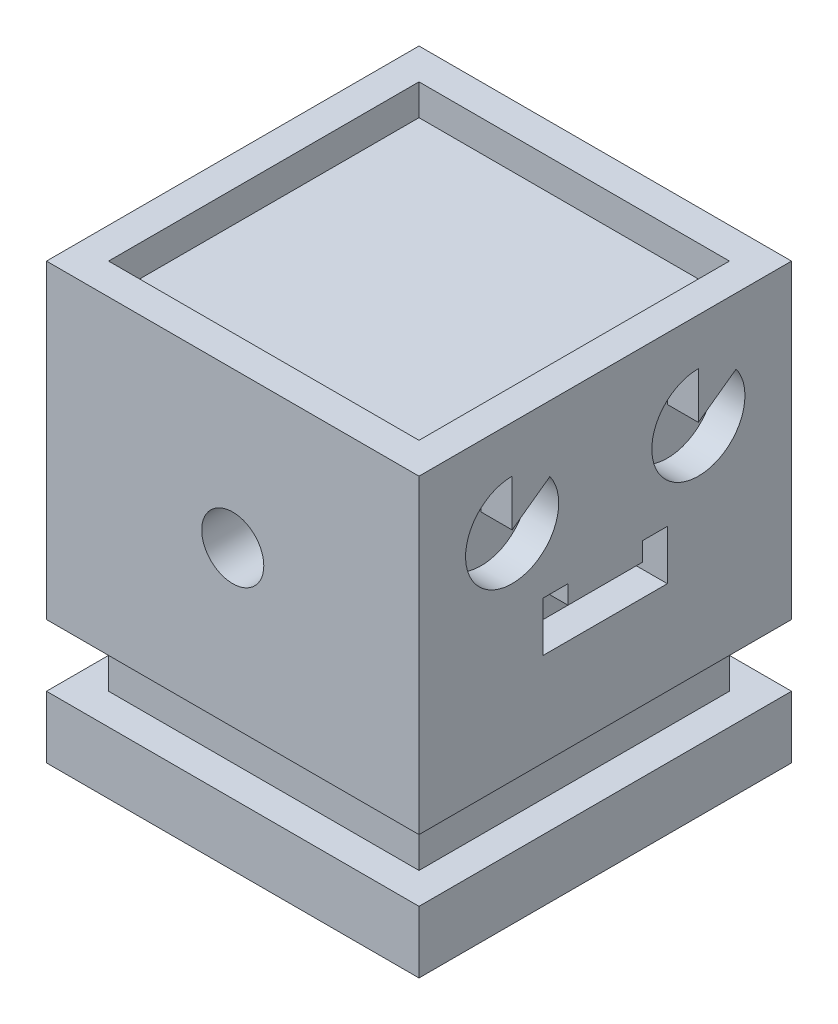
ISO-10303-21;
HEADER;
FILE_DESCRIPTION(('STEP AP214'),'2;1');
FILE_NAME('part.step','',(''),(''),'','','');
FILE_SCHEMA(('AUTOMOTIVE_DESIGN { 1 0 10303 214 1 1 1 1 }'));
ENDSEC;
DATA;
#1=APPLICATION_CONTEXT('core data for automotive mechanical design processes');
#2=APPLICATION_PROTOCOL_DEFINITION('international standard','automotive_design',2000,#1);
#3=PRODUCT_CONTEXT('',#1,'mechanical');
#4=PRODUCT('Part','Part','',(#3));
#5=PRODUCT_RELATED_PRODUCT_CATEGORY('part','',(#4));
#6=PRODUCT_DEFINITION_FORMATION('','',#4);
#7=PRODUCT_DEFINITION_CONTEXT('part definition',#1,'design');
#8=PRODUCT_DEFINITION('design','',#6,#7);
#9=PRODUCT_DEFINITION_SHAPE('','',#8);
#10=(LENGTH_UNIT() NAMED_UNIT(*) SI_UNIT(.MILLI.,.METRE.));
#11=(NAMED_UNIT(*) PLANE_ANGLE_UNIT() SI_UNIT($,.RADIAN.));
#12=(NAMED_UNIT(*) SI_UNIT($,.STERADIAN.) SOLID_ANGLE_UNIT());
#13=UNCERTAINTY_MEASURE_WITH_UNIT(LENGTH_MEASURE(1.E-05),#10,'distance_accuracy_value','');
#14=(GEOMETRIC_REPRESENTATION_CONTEXT(3) GLOBAL_UNCERTAINTY_ASSIGNED_CONTEXT((#13)) GLOBAL_UNIT_ASSIGNED_CONTEXT((#10,
#11,#12)) REPRESENTATION_CONTEXT('',''));
#15=CARTESIAN_POINT('',(0.,0.,0.));
#16=DIRECTION('',(0.,0.,1.));
#17=DIRECTION('',(1.,0.,0.));
#18=AXIS2_PLACEMENT_3D('',#15,#16,#17);
#19=CARTESIAN_POINT('',(0.,0.,60.));
#20=DIRECTION('',(0.,0.,-1.));
#21=DIRECTION('',(-1.,0.,0.));
#22=AXIS2_PLACEMENT_3D('',#19,#20,#21);
#23=PLANE('',#22);
#24=CARTESIAN_POINT('',(30.,45.,60.));
#25=DIRECTION('',(0.,0.,1.));
#26=DIRECTION('',(1.,0.,0.));
#27=AXIS2_PLACEMENT_3D('',#24,#25,#26);
#28=CIRCLE('',#27,5.);
#29=CARTESIAN_POINT('',(35.,45.,60.));
#30=VERTEX_POINT('',#29);
#31=EDGE_CURVE('E827',#30,#30,#28,.T.);
#32=ORIENTED_EDGE('',*,*,#31,.F.);
#33=EDGE_LOOP('',(#32));
#34=FACE_BOUND('',#33,.T.);
#35=DIRECTION('',(-1.,0.,0.));
#36=VECTOR('',#35,1.);
#37=CARTESIAN_POINT('',(0.,20.,60.));
#38=LINE('',#37,#36);
#39=CARTESIAN_POINT('',(60.,20.,60.));
#40=VERTEX_POINT('',#39);
#41=CARTESIAN_POINT('',(0.,20.,60.));
#42=VERTEX_POINT('',#41);
#43=EDGE_CURVE('E498',#40,#42,#38,.T.);
#44=ORIENTED_EDGE('',*,*,#43,.F.);
#45=DIRECTION('',(0.,1.,0.));
#46=VECTOR('',#45,1.);
#47=CARTESIAN_POINT('',(60.,0.,60.));
#48=LINE('',#47,#46);
#49=CARTESIAN_POINT('',(60.,70.,60.));
#50=VERTEX_POINT('',#49);
#51=EDGE_CURVE('E589',#40,#50,#48,.T.);
#52=ORIENTED_EDGE('',*,*,#51,.T.);
#53=DIRECTION('',(-1.,0.,0.));
#54=VECTOR('',#53,1.);
#55=CARTESIAN_POINT('',(0.,70.,60.));
#56=LINE('',#55,#54);
#57=CARTESIAN_POINT('',(0.,70.,60.));
#58=VERTEX_POINT('',#57);
#59=EDGE_CURVE('E594',#50,#58,#56,.T.);
#60=ORIENTED_EDGE('',*,*,#59,.T.);
#61=DIRECTION('',(0.,-1.,0.));
#62=VECTOR('',#61,1.);
#63=CARTESIAN_POINT('',(0.,0.,60.));
#64=LINE('',#63,#62);
#65=EDGE_CURVE('E581',#58,#42,#64,.T.);
#66=ORIENTED_EDGE('',*,*,#65,.T.);
#67=EDGE_LOOP('',(#44,#52,#60,#66));
#68=FACE_BOUND('',#67,.T.);
#69=ADVANCED_FACE('F39',(#34,#68),#23,.F.);
#70=CARTESIAN_POINT('',(0.,0.,0.));
#71=DIRECTION('',(0.,0.,-1.));
#72=DIRECTION('',(-1.,0.,0.));
#73=AXIS2_PLACEMENT_3D('',#70,#71,#72);
#74=PLANE('',#73);
#75=DIRECTION('',(1.,0.,0.));
#76=VECTOR('',#75,1.);
#77=CARTESIAN_POINT('',(0.,10.,0.));
#78=LINE('',#77,#76);
#79=CARTESIAN_POINT('',(0.,10.,0.));
#80=VERTEX_POINT('',#79);
#81=CARTESIAN_POINT('',(60.,10.,0.));
#82=VERTEX_POINT('',#81);
#83=EDGE_CURVE('E494',#80,#82,#78,.T.);
#84=ORIENTED_EDGE('',*,*,#83,.T.);
#85=DIRECTION('',(0.,1.,0.));
#86=VECTOR('',#85,1.);
#87=CARTESIAN_POINT('',(60.,0.,0.));
#88=LINE('',#87,#86);
#89=CARTESIAN_POINT('',(60.,0.,0.));
#90=VERTEX_POINT('',#89);
#91=EDGE_CURVE('E606',#90,#82,#88,.T.);
#92=ORIENTED_EDGE('',*,*,#91,.F.);
#93=DIRECTION('',(1.,0.,0.));
#94=VECTOR('',#93,1.);
#95=CARTESIAN_POINT('',(0.,0.,0.));
#96=LINE('',#95,#94);
#97=CARTESIAN_POINT('',(0.,0.,0.));
#98=VERTEX_POINT('',#97);
#99=EDGE_CURVE('E602',#98,#90,#96,.T.);
#100=ORIENTED_EDGE('',*,*,#99,.F.);
#101=DIRECTION('',(0.,-1.,0.));
#102=VECTOR('',#101,1.);
#103=CARTESIAN_POINT('',(0.,0.,0.));
#104=LINE('',#103,#102);
#105=EDGE_CURVE('E571',#80,#98,#104,.T.);
#106=ORIENTED_EDGE('',*,*,#105,.F.);
#107=EDGE_LOOP('',(#84,#92,#100,#106));
#108=FACE_BOUND('',#107,.T.);
#109=ADVANCED_FACE('F631',(#108),#74,.T.);
#110=CARTESIAN_POINT('',(0.,0.,60.));
#111=DIRECTION('',(1.,0.,0.));
#112=DIRECTION('',(0.,0.,-1.));
#113=AXIS2_PLACEMENT_3D('',#110,#111,#112);
#114=PLANE('',#113);
#115=CARTESIAN_POINT('',(0.,70.,0.));
#116=VERTEX_POINT('',#115);
#117=CARTESIAN_POINT('',(0.,20.,0.));
#118=VERTEX_POINT('',#117);
#119=EDGE_CURVE('E598',#116,#118,#104,.T.);
#120=ORIENTED_EDGE('',*,*,#119,.T.);
#121=DIRECTION('',(0.,0.,1.));
#122=VECTOR('',#121,1.);
#123=CARTESIAN_POINT('',(0.,20.,0.));
#124=LINE('',#123,#122);
#125=EDGE_CURVE('E511',#118,#42,#124,.T.);
#126=ORIENTED_EDGE('',*,*,#125,.T.);
#127=ORIENTED_EDGE('',*,*,#65,.F.);
#128=DIRECTION('',(0.,0.,-1.));
#129=VECTOR('',#128,1.);
#130=CARTESIAN_POINT('',(0.,70.,60.));
#131=LINE('',#130,#129);
#132=EDGE_CURVE('E597',#58,#116,#131,.T.);
#133=ORIENTED_EDGE('',*,*,#132,.T.);
#134=EDGE_LOOP('',(#120,#126,#127,#133));
#135=FACE_BOUND('',#134,.T.);
#136=ADVANCED_FACE('F665',(#135),#114,.F.);
#137=CARTESIAN_POINT('',(60.,0.,60.));
#138=DIRECTION('',(-1.,0.,0.));
#139=DIRECTION('',(0.,0.,1.));
#140=AXIS2_PLACEMENT_3D('',#137,#138,#139);
#141=PLANE('',#140);
#142=CARTESIAN_POINT('',(60.,55.,45.));
#143=DIRECTION('',(1.,0.,0.));
#144=DIRECTION('',(0.,0.,-1.));
#145=AXIS2_PLACEMENT_3D('',#142,#143,#144);
#146=CIRCLE('',#145,7.5);
#147=CARTESIAN_POINT('',(60.,62.5,45.));
#148=VERTEX_POINT('',#147);
#149=CARTESIAN_POINT('',(60.,59.4018531615386,38.9276290673038));
#150=VERTEX_POINT('',#149);
#151=EDGE_CURVE('E331',#148,#150,#146,.T.);
#152=ORIENTED_EDGE('',*,*,#151,.F.);
#153=DIRECTION('',(0.,1.,0.));
#154=VECTOR('',#153,1.);
#155=CARTESIAN_POINT('',(60.,0.,45.));
#156=LINE('',#155,#154);
#157=CARTESIAN_POINT('',(60.,55.,45.));
#158=VERTEX_POINT('',#157);
#159=EDGE_CURVE('E64',#158,#148,#156,.T.);
#160=ORIENTED_EDGE('',*,*,#159,.F.);
#161=DIRECTION('',(0.,0.586913754871805,-0.809649457692821));
#162=VECTOR('',#161,1.);
#163=CARTESIAN_POINT('',(60.,57.438021589324,41.6367411885402));
#164=LINE('',#163,#162);
#165=EDGE_CURVE('E321',#158,#150,#164,.T.);
#166=ORIENTED_EDGE('',*,*,#165,.T.);
#167=EDGE_LOOP('',(#152,#160,#166));
#168=FACE_BOUND('',#167,.T.);
#169=CARTESIAN_POINT('',(60.,55.,15.));
#170=DIRECTION('',(1.,0.,0.));
#171=DIRECTION('',(0.,0.,-1.));
#172=AXIS2_PLACEMENT_3D('',#169,#170,#171);
#173=CIRCLE('',#172,7.5);
#174=CARTESIAN_POINT('',(60.,62.5,15.));
#175=VERTEX_POINT('',#174);
#176=CARTESIAN_POINT('',(60.,59.4018531615385,8.92762906730384));
#177=VERTEX_POINT('',#176);
#178=EDGE_CURVE('E362',#175,#177,#173,.T.);
#179=ORIENTED_EDGE('',*,*,#178,.F.);
#180=DIRECTION('',(0.,1.,0.));
#181=VECTOR('',#180,1.);
#182=CARTESIAN_POINT('',(60.,55.,15.));
#183=LINE('',#182,#181);
#184=CARTESIAN_POINT('',(60.,55.,15.));
#185=VERTEX_POINT('',#184);
#186=EDGE_CURVE('E332',#185,#175,#183,.T.);
#187=ORIENTED_EDGE('',*,*,#186,.F.);
#188=DIRECTION('',(0.,0.586913754871805,-0.809649457692821));
#189=VECTOR('',#188,1.);
#190=CARTESIAN_POINT('',(60.,55.,15.));
#191=LINE('',#190,#189);
#192=EDGE_CURVE('E358',#185,#177,#191,.T.);
#193=ORIENTED_EDGE('',*,*,#192,.T.);
#194=EDGE_LOOP('',(#179,#187,#193));
#195=FACE_BOUND('',#194,.T.);
#196=DIRECTION('',(0.,-1.,0.));
#197=VECTOR('',#196,1.);
#198=CARTESIAN_POINT('',(60.,40.,40.));
#199=LINE('',#198,#197);
#200=CARTESIAN_POINT('',(60.,43.,40.));
#201=VERTEX_POINT('',#200);
#202=CARTESIAN_POINT('',(60.,35.,40.));
#203=VERTEX_POINT('',#202);
#204=EDGE_CURVE('E342',#201,#203,#199,.T.);
#205=ORIENTED_EDGE('',*,*,#204,.F.);
#206=DIRECTION('',(0.,0.,1.));
#207=VECTOR('',#206,1.);
#208=CARTESIAN_POINT('',(60.,43.,40.));
#209=LINE('',#208,#207);
#210=CARTESIAN_POINT('',(60.,43.,36.));
#211=VERTEX_POINT('',#210);
#212=EDGE_CURVE('E382',#211,#201,#209,.T.);
#213=ORIENTED_EDGE('',*,*,#212,.F.);
#214=DIRECTION('',(0.,1.,0.));
#215=VECTOR('',#214,1.);
#216=CARTESIAN_POINT('',(60.,40.,36.));
#217=LINE('',#216,#215);
#218=CARTESIAN_POINT('',(60.,40.,36.));
#219=VERTEX_POINT('',#218);
#220=EDGE_CURVE('E433',#219,#211,#217,.T.);
#221=ORIENTED_EDGE('',*,*,#220,.F.);
#222=DIRECTION('',(0.,0.,1.));
#223=VECTOR('',#222,1.);
#224=CARTESIAN_POINT('',(60.,40.,36.));
#225=LINE('',#224,#223);
#226=CARTESIAN_POINT('',(60.,40.,24.));
#227=VERTEX_POINT('',#226);
#228=EDGE_CURVE('E429',#227,#219,#225,.T.);
#229=ORIENTED_EDGE('',*,*,#228,.F.);
#230=DIRECTION('',(0.,-1.,0.));
#231=VECTOR('',#230,1.);
#232=CARTESIAN_POINT('',(60.,40.,24.));
#233=LINE('',#232,#231);
#234=CARTESIAN_POINT('',(60.,43.,24.));
#235=VERTEX_POINT('',#234);
#236=EDGE_CURVE('E425',#235,#227,#233,.T.);
#237=ORIENTED_EDGE('',*,*,#236,.F.);
#238=DIRECTION('',(0.,0.,1.));
#239=VECTOR('',#238,1.);
#240=CARTESIAN_POINT('',(60.,43.,24.));
#241=LINE('',#240,#239);
#242=CARTESIAN_POINT('',(60.,43.,20.));
#243=VERTEX_POINT('',#242);
#244=EDGE_CURVE('E421',#243,#235,#241,.T.);
#245=ORIENTED_EDGE('',*,*,#244,.F.);
#246=DIRECTION('',(0.,1.,0.));
#247=VECTOR('',#246,1.);
#248=CARTESIAN_POINT('',(60.,40.,20.));
#249=LINE('',#248,#247);
#250=CARTESIAN_POINT('',(60.,35.,20.));
#251=VERTEX_POINT('',#250);
#252=EDGE_CURVE('E417',#251,#243,#249,.T.);
#253=ORIENTED_EDGE('',*,*,#252,.F.);
#254=DIRECTION('',(0.,0.,-1.));
#255=VECTOR('',#254,1.);
#256=CARTESIAN_POINT('',(60.,35.,40.));
#257=LINE('',#256,#255);
#258=EDGE_CURVE('E413',#203,#251,#257,.T.);
#259=ORIENTED_EDGE('',*,*,#258,.F.);
#260=EDGE_LOOP('',(#205,#213,#221,#229,#237,#245,#253,#259));
#261=FACE_BOUND('',#260,.T.);
#262=ORIENTED_EDGE('',*,*,#51,.F.);
#263=DIRECTION('',(0.,0.,1.));
#264=VECTOR('',#263,1.);
#265=CARTESIAN_POINT('',(60.,20.,0.));
#266=LINE('',#265,#264);
#267=CARTESIAN_POINT('',(60.,20.,0.));
#268=VERTEX_POINT('',#267);
#269=EDGE_CURVE('E507',#268,#40,#266,.T.);
#270=ORIENTED_EDGE('',*,*,#269,.F.);
#271=CARTESIAN_POINT('',(60.,70.,0.));
#272=VERTEX_POINT('',#271);
#273=EDGE_CURVE('E605',#268,#272,#88,.T.);
#274=ORIENTED_EDGE('',*,*,#273,.T.);
#275=DIRECTION('',(0.,0.,-1.));
#276=VECTOR('',#275,1.);
#277=CARTESIAN_POINT('',(60.,70.,60.));
#278=LINE('',#277,#276);
#279=EDGE_CURVE('E616',#50,#272,#278,.T.);
#280=ORIENTED_EDGE('',*,*,#279,.F.);
#281=EDGE_LOOP('',(#262,#270,#274,#280));
#282=FACE_BOUND('',#281,.T.);
#283=ADVANCED_FACE('F657',(#168,#195,#261,#282),#141,.F.);
#284=CARTESIAN_POINT('',(0.,10.,60.));
#285=VERTEX_POINT('',#284);
#286=CARTESIAN_POINT('',(0.,0.,60.));
#287=VERTEX_POINT('',#286);
#288=EDGE_CURVE('E586',#285,#287,#64,.T.);
#289=ORIENTED_EDGE('',*,*,#288,.F.);
#290=DIRECTION('',(0.,0.,1.));
#291=VECTOR('',#290,1.);
#292=CARTESIAN_POINT('',(0.,10.,0.));
#293=LINE('',#292,#291);
#294=EDGE_CURVE('E502',#80,#285,#293,.T.);
#295=ORIENTED_EDGE('',*,*,#294,.F.);
#296=ORIENTED_EDGE('',*,*,#105,.T.);
#297=DIRECTION('',(0.,0.,-1.));
#298=VECTOR('',#297,1.);
#299=CARTESIAN_POINT('',(0.,0.,60.));
#300=LINE('',#299,#298);
#301=EDGE_CURVE('E11',#287,#98,#300,.T.);
#302=ORIENTED_EDGE('',*,*,#301,.F.);
#303=EDGE_LOOP('',(#289,#295,#296,#302));
#304=FACE_BOUND('',#303,.T.);
#305=ADVANCED_FACE('F41',(#304),#114,.F.);
#306=CARTESIAN_POINT('',(0.,0.,60.));
#307=DIRECTION('',(0.,1.,0.));
#308=DIRECTION('',(0.,0.,1.));
#309=AXIS2_PLACEMENT_3D('',#306,#307,#308);
#310=PLANE('',#309);
#311=DIRECTION('',(-1.,0.,0.));
#312=VECTOR('',#311,1.);
#313=CARTESIAN_POINT('',(50.,0.,50.));
#314=LINE('',#313,#312);
#315=CARTESIAN_POINT('',(50.,0.,50.));
#316=VERTEX_POINT('',#315);
#317=CARTESIAN_POINT('',(10.,0.,50.));
#318=VERTEX_POINT('',#317);
#319=EDGE_CURVE('E301',#316,#318,#314,.T.);
#320=ORIENTED_EDGE('',*,*,#319,.F.);
#321=DIRECTION('',(0.,0.,1.));
#322=VECTOR('',#321,1.);
#323=CARTESIAN_POINT('',(50.,0.,50.));
#324=LINE('',#323,#322);
#325=CARTESIAN_POINT('',(50.,0.,10.));
#326=VERTEX_POINT('',#325);
#327=EDGE_CURVE('E56',#326,#316,#324,.T.);
#328=ORIENTED_EDGE('',*,*,#327,.F.);
#329=DIRECTION('',(1.,0.,0.));
#330=VECTOR('',#329,1.);
#331=CARTESIAN_POINT('',(50.,0.,10.));
#332=LINE('',#331,#330);
#333=CARTESIAN_POINT('',(10.,0.,10.));
#334=VERTEX_POINT('',#333);
#335=EDGE_CURVE('E285',#334,#326,#332,.T.);
#336=ORIENTED_EDGE('',*,*,#335,.F.);
#337=DIRECTION('',(0.,0.,-1.));
#338=VECTOR('',#337,1.);
#339=CARTESIAN_POINT('',(10.,0.,50.));
#340=LINE('',#339,#338);
#341=EDGE_CURVE('E289',#318,#334,#340,.T.);
#342=ORIENTED_EDGE('',*,*,#341,.F.);
#343=EDGE_LOOP('',(#320,#328,#336,#342));
#344=FACE_BOUND('',#343,.T.);
#345=ORIENTED_EDGE('',*,*,#99,.T.);
#346=DIRECTION('',(0.,0.,-1.));
#347=VECTOR('',#346,1.);
#348=CARTESIAN_POINT('',(60.,0.,60.));
#349=LINE('',#348,#347);
#350=CARTESIAN_POINT('',(60.,0.,60.));
#351=VERTEX_POINT('',#350);
#352=EDGE_CURVE('E49',#351,#90,#349,.T.);
#353=ORIENTED_EDGE('',*,*,#352,.F.);
#354=DIRECTION('',(1.,0.,0.));
#355=VECTOR('',#354,1.);
#356=CARTESIAN_POINT('',(0.,0.,60.));
#357=LINE('',#356,#355);
#358=EDGE_CURVE('E585',#287,#351,#357,.T.);
#359=ORIENTED_EDGE('',*,*,#358,.F.);
#360=ORIENTED_EDGE('',*,*,#301,.T.);
#361=EDGE_LOOP('',(#345,#353,#359,#360));
#362=FACE_BOUND('',#361,.T.);
#363=ADVANCED_FACE('F643',(#344,#362),#310,.F.);
#364=ORIENTED_EDGE('',*,*,#91,.T.);
#365=DIRECTION('',(0.,0.,1.));
#366=VECTOR('',#365,1.);
#367=CARTESIAN_POINT('',(60.,10.,0.));
#368=LINE('',#367,#366);
#369=CARTESIAN_POINT('',(60.,10.,60.));
#370=VERTEX_POINT('',#369);
#371=EDGE_CURVE('E527',#82,#370,#368,.T.);
#372=ORIENTED_EDGE('',*,*,#371,.T.);
#373=EDGE_CURVE('E590',#351,#370,#48,.T.);
#374=ORIENTED_EDGE('',*,*,#373,.F.);
#375=ORIENTED_EDGE('',*,*,#352,.T.);
#376=EDGE_LOOP('',(#364,#372,#374,#375));
#377=FACE_BOUND('',#376,.T.);
#378=ADVANCED_FACE('F626',(#377),#141,.F.);
#379=CARTESIAN_POINT('',(0.,70.,60.));
#380=DIRECTION('',(0.,-1.,0.));
#381=DIRECTION('',(0.,0.,-1.));
#382=AXIS2_PLACEMENT_3D('',#379,#380,#381);
#383=PLANE('',#382);
#384=DIRECTION('',(1.,0.,0.));
#385=VECTOR('',#384,1.);
#386=CARTESIAN_POINT('',(5.,70.,55.));
#387=LINE('',#386,#385);
#388=CARTESIAN_POINT('',(5.,70.,55.));
#389=VERTEX_POINT('',#388);
#390=CARTESIAN_POINT('',(55.,70.,55.));
#391=VERTEX_POINT('',#390);
#392=EDGE_CURVE('E557',#389,#391,#387,.T.);
#393=ORIENTED_EDGE('',*,*,#392,.F.);
#394=DIRECTION('',(0.,0.,1.));
#395=VECTOR('',#394,1.);
#396=CARTESIAN_POINT('',(5.,70.,55.));
#397=LINE('',#396,#395);
#398=CARTESIAN_POINT('',(5.,70.,5.));
#399=VERTEX_POINT('',#398);
#400=EDGE_CURVE('E514',#399,#389,#397,.T.);
#401=ORIENTED_EDGE('',*,*,#400,.F.);
#402=DIRECTION('',(-1.,0.,0.));
#403=VECTOR('',#402,1.);
#404=CARTESIAN_POINT('',(5.,70.,5.));
#405=LINE('',#404,#403);
#406=CARTESIAN_POINT('',(55.,70.,5.));
#407=VERTEX_POINT('',#406);
#408=EDGE_CURVE('E542',#407,#399,#405,.T.);
#409=ORIENTED_EDGE('',*,*,#408,.F.);
#410=DIRECTION('',(0.,0.,-1.));
#411=VECTOR('',#410,1.);
#412=CARTESIAN_POINT('',(55.,70.,55.));
#413=LINE('',#412,#411);
#414=EDGE_CURVE('E561',#391,#407,#413,.T.);
#415=ORIENTED_EDGE('',*,*,#414,.F.);
#416=EDGE_LOOP('',(#393,#401,#409,#415));
#417=FACE_BOUND('',#416,.T.);
#418=DIRECTION('',(-1.,0.,0.));
#419=VECTOR('',#418,1.);
#420=CARTESIAN_POINT('',(0.,70.,0.));
#421=LINE('',#420,#419);
#422=EDGE_CURVE('E610',#272,#116,#421,.T.);
#423=ORIENTED_EDGE('',*,*,#422,.T.);
#424=ORIENTED_EDGE('',*,*,#132,.F.);
#425=ORIENTED_EDGE('',*,*,#59,.F.);
#426=ORIENTED_EDGE('',*,*,#279,.T.);
#427=EDGE_LOOP('',(#423,#424,#425,#426));
#428=FACE_BOUND('',#427,.T.);
#429=ADVANCED_FACE('F661',(#417,#428),#383,.F.);
#430=ORIENTED_EDGE('',*,*,#373,.T.);
#431=DIRECTION('',(1.,0.,0.));
#432=VECTOR('',#431,1.);
#433=CARTESIAN_POINT('',(0.,10.,60.));
#434=LINE('',#433,#432);
#435=EDGE_CURVE('E503',#285,#370,#434,.T.);
#436=ORIENTED_EDGE('',*,*,#435,.F.);
#437=ORIENTED_EDGE('',*,*,#288,.T.);
#438=ORIENTED_EDGE('',*,*,#358,.T.);
#439=EDGE_LOOP('',(#430,#436,#437,#438));
#440=FACE_BOUND('',#439,.T.);
#441=ADVANCED_FACE('F641',(#440),#23,.F.);
#442=CARTESIAN_POINT('',(30.,45.,0.));
#443=DIRECTION('',(0.,0.,1.));
#444=DIRECTION('',(1.,0.,0.));
#445=AXIS2_PLACEMENT_3D('',#442,#443,#444);
#446=CIRCLE('',#445,5.);
#447=CARTESIAN_POINT('',(35.,45.,0.));
#448=VERTEX_POINT('',#447);
#449=EDGE_CURVE('E819',#448,#448,#446,.T.);
#450=ORIENTED_EDGE('',*,*,#449,.T.);
#451=EDGE_LOOP('',(#450));
#452=FACE_BOUND('',#451,.T.);
#453=ORIENTED_EDGE('',*,*,#273,.F.);
#454=DIRECTION('',(-1.,0.,0.));
#455=VECTOR('',#454,1.);
#456=CARTESIAN_POINT('',(0.,20.,0.));
#457=LINE('',#456,#455);
#458=EDGE_CURVE('E497',#268,#118,#457,.T.);
#459=ORIENTED_EDGE('',*,*,#458,.T.);
#460=ORIENTED_EDGE('',*,*,#119,.F.);
#461=ORIENTED_EDGE('',*,*,#422,.F.);
#462=EDGE_LOOP('',(#453,#459,#460,#461));
#463=FACE_BOUND('',#462,.T.);
#464=ADVANCED_FACE('F669',(#452,#463),#74,.T.);
#465=CARTESIAN_POINT('',(5.,65.,55.));
#466=DIRECTION('',(-1.,0.,0.));
#467=DIRECTION('',(0.,0.,1.));
#468=AXIS2_PLACEMENT_3D('',#465,#466,#467);
#469=PLANE('',#468);
#470=ORIENTED_EDGE('',*,*,#400,.T.);
#471=DIRECTION('',(0.,1.,0.));
#472=VECTOR('',#471,1.);
#473=CARTESIAN_POINT('',(5.,65.,55.));
#474=LINE('',#473,#472);
#475=CARTESIAN_POINT('',(5.,65.,55.));
#476=VERTEX_POINT('',#475);
#477=EDGE_CURVE('E554',#476,#389,#474,.T.);
#478=ORIENTED_EDGE('',*,*,#477,.F.);
#479=DIRECTION('',(0.,0.,1.));
#480=VECTOR('',#479,1.);
#481=CARTESIAN_POINT('',(5.,65.,55.));
#482=LINE('',#481,#480);
#483=CARTESIAN_POINT('',(5.,65.,5.));
#484=VERTEX_POINT('',#483);
#485=EDGE_CURVE('E537',#484,#476,#482,.T.);
#486=ORIENTED_EDGE('',*,*,#485,.F.);
#487=DIRECTION('',(0.,1.,0.));
#488=VECTOR('',#487,1.);
#489=CARTESIAN_POINT('',(5.,65.,5.));
#490=LINE('',#489,#488);
#491=EDGE_CURVE('E568',#484,#399,#490,.T.);
#492=ORIENTED_EDGE('',*,*,#491,.T.);
#493=EDGE_LOOP('',(#470,#478,#486,#492));
#494=FACE_BOUND('',#493,.T.);
#495=ADVANCED_FACE('F671',(#494),#469,.F.);
#496=CARTESIAN_POINT('',(5.,65.,5.));
#497=DIRECTION('',(0.,0.,-1.));
#498=DIRECTION('',(-1.,0.,0.));
#499=AXIS2_PLACEMENT_3D('',#496,#497,#498);
#500=PLANE('',#499);
#501=ORIENTED_EDGE('',*,*,#408,.T.);
#502=ORIENTED_EDGE('',*,*,#491,.F.);
#503=DIRECTION('',(-1.,0.,0.));
#504=VECTOR('',#503,1.);
#505=CARTESIAN_POINT('',(5.,65.,5.));
#506=LINE('',#505,#504);
#507=CARTESIAN_POINT('',(55.,65.,5.));
#508=VERTEX_POINT('',#507);
#509=EDGE_CURVE('E550',#508,#484,#506,.T.);
#510=ORIENTED_EDGE('',*,*,#509,.F.);
#511=DIRECTION('',(0.,1.,0.));
#512=VECTOR('',#511,1.);
#513=CARTESIAN_POINT('',(55.,65.,5.));
#514=LINE('',#513,#512);
#515=EDGE_CURVE('E572',#508,#407,#514,.T.);
#516=ORIENTED_EDGE('',*,*,#515,.T.);
#517=EDGE_LOOP('',(#501,#502,#510,#516));
#518=FACE_BOUND('',#517,.T.);
#519=ADVANCED_FACE('F678',(#518),#500,.F.);
#520=CARTESIAN_POINT('',(55.,65.,55.));
#521=DIRECTION('',(1.,0.,0.));
#522=DIRECTION('',(0.,0.,-1.));
#523=AXIS2_PLACEMENT_3D('',#520,#521,#522);
#524=PLANE('',#523);
#525=ORIENTED_EDGE('',*,*,#414,.T.);
#526=ORIENTED_EDGE('',*,*,#515,.F.);
#527=DIRECTION('',(0.,0.,-1.));
#528=VECTOR('',#527,1.);
#529=CARTESIAN_POINT('',(55.,65.,55.));
#530=LINE('',#529,#528);
#531=CARTESIAN_POINT('',(55.,65.,55.));
#532=VERTEX_POINT('',#531);
#533=EDGE_CURVE('E546',#532,#508,#530,.T.);
#534=ORIENTED_EDGE('',*,*,#533,.F.);
#535=DIRECTION('',(0.,1.,0.));
#536=VECTOR('',#535,1.);
#537=CARTESIAN_POINT('',(55.,65.,55.));
#538=LINE('',#537,#536);
#539=EDGE_CURVE('E575',#532,#391,#538,.T.);
#540=ORIENTED_EDGE('',*,*,#539,.T.);
#541=EDGE_LOOP('',(#525,#526,#534,#540));
#542=FACE_BOUND('',#541,.T.);
#543=ADVANCED_FACE('F695',(#542),#524,.F.);
#544=CARTESIAN_POINT('',(5.,65.,55.));
#545=DIRECTION('',(0.,0.,1.));
#546=DIRECTION('',(1.,0.,0.));
#547=AXIS2_PLACEMENT_3D('',#544,#545,#546);
#548=PLANE('',#547);
#549=ORIENTED_EDGE('',*,*,#392,.T.);
#550=ORIENTED_EDGE('',*,*,#539,.F.);
#551=DIRECTION('',(1.,0.,0.));
#552=VECTOR('',#551,1.);
#553=CARTESIAN_POINT('',(5.,65.,55.));
#554=LINE('',#553,#552);
#555=EDGE_CURVE('E541',#476,#532,#554,.T.);
#556=ORIENTED_EDGE('',*,*,#555,.F.);
#557=ORIENTED_EDGE('',*,*,#477,.T.);
#558=EDGE_LOOP('',(#549,#550,#556,#557));
#559=FACE_BOUND('',#558,.T.);
#560=ADVANCED_FACE('F691',(#559),#548,.F.);
#561=CARTESIAN_POINT('',(0.,65.,0.));
#562=DIRECTION('',(0.,-1.,0.));
#563=DIRECTION('',(0.,0.,-1.));
#564=AXIS2_PLACEMENT_3D('',#561,#562,#563);
#565=PLANE('',#564);
#566=ORIENTED_EDGE('',*,*,#485,.T.);
#567=ORIENTED_EDGE('',*,*,#555,.T.);
#568=ORIENTED_EDGE('',*,*,#533,.T.);
#569=ORIENTED_EDGE('',*,*,#509,.T.);
#570=EDGE_LOOP('',(#566,#567,#568,#569));
#571=FACE_BOUND('',#570,.T.);
#572=ADVANCED_FACE('F694',(#571),#565,.F.);
#573=CARTESIAN_POINT('',(55.,20.,0.));
#574=DIRECTION('',(-1.,0.,0.));
#575=DIRECTION('',(0.,-1.,0.));
#576=AXIS2_PLACEMENT_3D('',#573,#574,#575);
#577=PLANE('',#576);
#578=DIRECTION('',(0.,0.,1.));
#579=VECTOR('',#578,1.);
#580=CARTESIAN_POINT('',(55.,20.,0.));
#581=LINE('',#580,#579);
#582=CARTESIAN_POINT('',(55.,20.,5.));
#583=VERTEX_POINT('',#582);
#584=CARTESIAN_POINT('',(55.,20.,55.));
#585=VERTEX_POINT('',#584);
#586=EDGE_CURVE('E493',#583,#585,#581,.T.);
#587=ORIENTED_EDGE('',*,*,#586,.T.);
#588=DIRECTION('',(0.,-1.,0.));
#589=VECTOR('',#588,1.);
#590=CARTESIAN_POINT('',(55.,20.,55.));
#591=LINE('',#590,#589);
#592=CARTESIAN_POINT('',(55.,10.,55.));
#593=VERTEX_POINT('',#592);
#594=EDGE_CURVE('E489',#585,#593,#591,.T.);
#595=ORIENTED_EDGE('',*,*,#594,.T.);
#596=DIRECTION('',(0.,0.,1.));
#597=VECTOR('',#596,1.);
#598=CARTESIAN_POINT('',(55.,10.,0.));
#599=LINE('',#598,#597);
#600=CARTESIAN_POINT('',(55.,10.,5.));
#601=VERTEX_POINT('',#600);
#602=EDGE_CURVE('E530',#601,#593,#599,.T.);
#603=ORIENTED_EDGE('',*,*,#602,.F.);
#604=DIRECTION('',(0.,1.,0.));
#605=VECTOR('',#604,1.);
#606=CARTESIAN_POINT('',(55.,20.,5.));
#607=LINE('',#606,#605);
#608=EDGE_CURVE('E481',#601,#583,#607,.T.);
#609=ORIENTED_EDGE('',*,*,#608,.T.);
#610=EDGE_LOOP('',(#587,#595,#603,#609));
#611=FACE_BOUND('',#610,.T.);
#612=ADVANCED_FACE('F705',(#611),#577,.F.);
#613=CARTESIAN_POINT('',(0.,20.,0.));
#614=DIRECTION('',(0.,1.,0.));
#615=DIRECTION('',(0.,0.,1.));
#616=AXIS2_PLACEMENT_3D('',#613,#614,#615);
#617=PLANE('',#616);
#618=DIRECTION('',(1.,0.,0.));
#619=VECTOR('',#618,1.);
#620=CARTESIAN_POINT('',(0.,20.,55.));
#621=LINE('',#620,#619);
#622=CARTESIAN_POINT('',(5.,20.,55.));
#623=VERTEX_POINT('',#622);
#624=EDGE_CURVE('E464',#623,#585,#621,.T.);
#625=ORIENTED_EDGE('',*,*,#624,.T.);
#626=ORIENTED_EDGE('',*,*,#586,.F.);
#627=DIRECTION('',(1.,0.,0.));
#628=VECTOR('',#627,1.);
#629=CARTESIAN_POINT('',(0.,20.,5.));
#630=LINE('',#629,#628);
#631=CARTESIAN_POINT('',(5.,20.,5.));
#632=VERTEX_POINT('',#631);
#633=EDGE_CURVE('E443',#632,#583,#630,.T.);
#634=ORIENTED_EDGE('',*,*,#633,.F.);
#635=DIRECTION('',(0.,0.,1.));
#636=VECTOR('',#635,1.);
#637=CARTESIAN_POINT('',(5.,20.,0.));
#638=LINE('',#637,#636);
#639=EDGE_CURVE('E515',#632,#623,#638,.T.);
#640=ORIENTED_EDGE('',*,*,#639,.T.);
#641=EDGE_LOOP('',(#625,#626,#634,#640));
#642=FACE_BOUND('',#641,.T.);
#643=ORIENTED_EDGE('',*,*,#269,.T.);
#644=ORIENTED_EDGE('',*,*,#43,.T.);
#645=ORIENTED_EDGE('',*,*,#125,.F.);
#646=ORIENTED_EDGE('',*,*,#458,.F.);
#647=EDGE_LOOP('',(#643,#644,#645,#646));
#648=FACE_BOUND('',#647,.T.);
#649=ADVANCED_FACE('F667',(#642,#648),#617,.F.);
#650=CARTESIAN_POINT('',(5.,20.,0.));
#651=DIRECTION('',(1.,0.,0.));
#652=DIRECTION('',(0.,1.,0.));
#653=AXIS2_PLACEMENT_3D('',#650,#651,#652);
#654=PLANE('',#653);
#655=DIRECTION('',(0.,0.,1.));
#656=VECTOR('',#655,1.);
#657=CARTESIAN_POINT('',(5.,10.,0.));
#658=LINE('',#657,#656);
#659=CARTESIAN_POINT('',(5.,10.,5.));
#660=VERTEX_POINT('',#659);
#661=CARTESIAN_POINT('',(5.,10.,55.));
#662=VERTEX_POINT('',#661);
#663=EDGE_CURVE('E519',#660,#662,#658,.T.);
#664=ORIENTED_EDGE('',*,*,#663,.T.);
#665=DIRECTION('',(0.,1.,0.));
#666=VECTOR('',#665,1.);
#667=CARTESIAN_POINT('',(5.,20.,55.));
#668=LINE('',#667,#666);
#669=EDGE_CURVE('E485',#662,#623,#668,.T.);
#670=ORIENTED_EDGE('',*,*,#669,.T.);
#671=ORIENTED_EDGE('',*,*,#639,.F.);
#672=DIRECTION('',(0.,-1.,0.));
#673=VECTOR('',#672,1.);
#674=CARTESIAN_POINT('',(5.,20.,5.));
#675=LINE('',#674,#673);
#676=EDGE_CURVE('E468',#632,#660,#675,.T.);
#677=ORIENTED_EDGE('',*,*,#676,.T.);
#678=EDGE_LOOP('',(#664,#670,#671,#677));
#679=FACE_BOUND('',#678,.T.);
#680=ADVANCED_FACE('F713',(#679),#654,.F.);
#681=CARTESIAN_POINT('',(0.,10.,0.));
#682=DIRECTION('',(0.,-1.,0.));
#683=DIRECTION('',(1.,0.,0.));
#684=AXIS2_PLACEMENT_3D('',#681,#682,#683);
#685=PLANE('',#684);
#686=ORIENTED_EDGE('',*,*,#435,.T.);
#687=ORIENTED_EDGE('',*,*,#371,.F.);
#688=ORIENTED_EDGE('',*,*,#83,.F.);
#689=ORIENTED_EDGE('',*,*,#294,.T.);
#690=EDGE_LOOP('',(#686,#687,#688,#689));
#691=FACE_BOUND('',#690,.T.);
#692=ORIENTED_EDGE('',*,*,#602,.T.);
#693=DIRECTION('',(1.,0.,0.));
#694=VECTOR('',#693,1.);
#695=CARTESIAN_POINT('',(0.,10.,55.));
#696=LINE('',#695,#694);
#697=EDGE_CURVE('E469',#662,#593,#696,.T.);
#698=ORIENTED_EDGE('',*,*,#697,.F.);
#699=ORIENTED_EDGE('',*,*,#663,.F.);
#700=DIRECTION('',(1.,0.,0.));
#701=VECTOR('',#700,1.);
#702=CARTESIAN_POINT('',(0.,10.,5.));
#703=LINE('',#702,#701);
#704=EDGE_CURVE('E472',#660,#601,#703,.T.);
#705=ORIENTED_EDGE('',*,*,#704,.T.);
#706=EDGE_LOOP('',(#692,#698,#699,#705));
#707=FACE_BOUND('',#706,.T.);
#708=ADVANCED_FACE('F636',(#691,#707),#685,.F.);
#709=CARTESIAN_POINT('',(0.,20.,5.));
#710=DIRECTION('',(0.,0.,1.));
#711=DIRECTION('',(1.,0.,0.));
#712=AXIS2_PLACEMENT_3D('',#709,#710,#711);
#713=PLANE('',#712);
#714=ORIENTED_EDGE('',*,*,#704,.F.);
#715=ORIENTED_EDGE('',*,*,#676,.F.);
#716=ORIENTED_EDGE('',*,*,#633,.T.);
#717=ORIENTED_EDGE('',*,*,#608,.F.);
#718=EDGE_LOOP('',(#714,#715,#716,#717));
#719=FACE_BOUND('',#718,.T.);
#720=ADVANCED_FACE('F712',(#719),#713,.F.);
#721=CARTESIAN_POINT('',(0.,20.,55.));
#722=DIRECTION('',(0.,0.,-1.));
#723=DIRECTION('',(-1.,0.,0.));
#724=AXIS2_PLACEMENT_3D('',#721,#722,#723);
#725=PLANE('',#724);
#726=ORIENTED_EDGE('',*,*,#624,.F.);
#727=ORIENTED_EDGE('',*,*,#669,.F.);
#728=ORIENTED_EDGE('',*,*,#697,.T.);
#729=ORIENTED_EDGE('',*,*,#594,.F.);
#730=EDGE_LOOP('',(#726,#727,#728,#729));
#731=FACE_BOUND('',#730,.T.);
#732=ADVANCED_FACE('F722',(#731),#725,.F.);
#733=CARTESIAN_POINT('',(55.,43.,40.));
#734=DIRECTION('',(0.,1.,0.));
#735=DIRECTION('',(0.,0.,1.));
#736=AXIS2_PLACEMENT_3D('',#733,#734,#735);
#737=PLANE('',#736);
#738=ORIENTED_EDGE('',*,*,#212,.T.);
#739=DIRECTION('',(1.,0.,0.));
#740=VECTOR('',#739,1.);
#741=CARTESIAN_POINT('',(55.,43.,40.));
#742=LINE('',#741,#740);
#743=CARTESIAN_POINT('',(55.,43.,40.));
#744=VERTEX_POINT('',#743);
#745=EDGE_CURVE('E439',#744,#201,#742,.T.);
#746=ORIENTED_EDGE('',*,*,#745,.F.);
#747=DIRECTION('',(0.,0.,1.));
#748=VECTOR('',#747,1.);
#749=CARTESIAN_POINT('',(55.,43.,40.));
#750=LINE('',#749,#748);
#751=CARTESIAN_POINT('',(55.,43.,36.));
#752=VERTEX_POINT('',#751);
#753=EDGE_CURVE('E405',#752,#744,#750,.T.);
#754=ORIENTED_EDGE('',*,*,#753,.F.);
#755=DIRECTION('',(1.,0.,0.));
#756=VECTOR('',#755,1.);
#757=CARTESIAN_POINT('',(55.,43.,36.));
#758=LINE('',#757,#756);
#759=EDGE_CURVE('E444',#752,#211,#758,.T.);
#760=ORIENTED_EDGE('',*,*,#759,.T.);
#761=EDGE_LOOP('',(#738,#746,#754,#760));
#762=FACE_BOUND('',#761,.T.);
#763=ADVANCED_FACE('F726',(#762),#737,.F.);
#764=CARTESIAN_POINT('',(55.,40.,36.));
#765=DIRECTION('',(0.,0.,-1.));
#766=DIRECTION('',(-1.,0.,0.));
#767=AXIS2_PLACEMENT_3D('',#764,#765,#766);
#768=PLANE('',#767);
#769=ORIENTED_EDGE('',*,*,#220,.T.);
#770=ORIENTED_EDGE('',*,*,#759,.F.);
#771=DIRECTION('',(0.,1.,0.));
#772=VECTOR('',#771,1.);
#773=CARTESIAN_POINT('',(55.,40.,36.));
#774=LINE('',#773,#772);
#775=CARTESIAN_POINT('',(55.,40.,36.));
#776=VERTEX_POINT('',#775);
#777=EDGE_CURVE('E401',#776,#752,#774,.T.);
#778=ORIENTED_EDGE('',*,*,#777,.F.);
#779=DIRECTION('',(1.,0.,0.));
#780=VECTOR('',#779,1.);
#781=CARTESIAN_POINT('',(55.,40.,36.));
#782=LINE('',#781,#780);
#783=EDGE_CURVE('E447',#776,#219,#782,.T.);
#784=ORIENTED_EDGE('',*,*,#783,.T.);
#785=EDGE_LOOP('',(#769,#770,#778,#784));
#786=FACE_BOUND('',#785,.T.);
#787=ADVANCED_FACE('F752',(#786),#768,.F.);
#788=CARTESIAN_POINT('',(55.,40.,36.));
#789=DIRECTION('',(0.,1.,0.));
#790=DIRECTION('',(0.,0.,1.));
#791=AXIS2_PLACEMENT_3D('',#788,#789,#790);
#792=PLANE('',#791);
#793=ORIENTED_EDGE('',*,*,#228,.T.);
#794=ORIENTED_EDGE('',*,*,#783,.F.);
#795=DIRECTION('',(0.,0.,1.));
#796=VECTOR('',#795,1.);
#797=CARTESIAN_POINT('',(55.,40.,36.));
#798=LINE('',#797,#796);
#799=CARTESIAN_POINT('',(55.,40.,24.));
#800=VERTEX_POINT('',#799);
#801=EDGE_CURVE('E397',#800,#776,#798,.T.);
#802=ORIENTED_EDGE('',*,*,#801,.F.);
#803=DIRECTION('',(1.,0.,0.));
#804=VECTOR('',#803,1.);
#805=CARTESIAN_POINT('',(55.,40.,24.));
#806=LINE('',#805,#804);
#807=EDGE_CURVE('E450',#800,#227,#806,.T.);
#808=ORIENTED_EDGE('',*,*,#807,.T.);
#809=EDGE_LOOP('',(#793,#794,#802,#808));
#810=FACE_BOUND('',#809,.T.);
#811=ADVANCED_FACE('F748',(#810),#792,.F.);
#812=CARTESIAN_POINT('',(55.,40.,24.));
#813=DIRECTION('',(0.,0.,1.));
#814=DIRECTION('',(1.,0.,0.));
#815=AXIS2_PLACEMENT_3D('',#812,#813,#814);
#816=PLANE('',#815);
#817=ORIENTED_EDGE('',*,*,#236,.T.);
#818=ORIENTED_EDGE('',*,*,#807,.F.);
#819=DIRECTION('',(0.,-1.,0.));
#820=VECTOR('',#819,1.);
#821=CARTESIAN_POINT('',(55.,40.,24.));
#822=LINE('',#821,#820);
#823=CARTESIAN_POINT('',(55.,43.,24.));
#824=VERTEX_POINT('',#823);
#825=EDGE_CURVE('E393',#824,#800,#822,.T.);
#826=ORIENTED_EDGE('',*,*,#825,.F.);
#827=DIRECTION('',(1.,0.,0.));
#828=VECTOR('',#827,1.);
#829=CARTESIAN_POINT('',(55.,43.,24.));
#830=LINE('',#829,#828);
#831=EDGE_CURVE('E453',#824,#235,#830,.T.);
#832=ORIENTED_EDGE('',*,*,#831,.T.);
#833=EDGE_LOOP('',(#817,#818,#826,#832));
#834=FACE_BOUND('',#833,.T.);
#835=ADVANCED_FACE('F744',(#834),#816,.F.);
#836=CARTESIAN_POINT('',(55.,43.,24.));
#837=DIRECTION('',(0.,1.,0.));
#838=DIRECTION('',(0.,0.,1.));
#839=AXIS2_PLACEMENT_3D('',#836,#837,#838);
#840=PLANE('',#839);
#841=ORIENTED_EDGE('',*,*,#244,.T.);
#842=ORIENTED_EDGE('',*,*,#831,.F.);
#843=DIRECTION('',(0.,0.,1.));
#844=VECTOR('',#843,1.);
#845=CARTESIAN_POINT('',(55.,43.,24.));
#846=LINE('',#845,#844);
#847=CARTESIAN_POINT('',(55.,43.,20.));
#848=VERTEX_POINT('',#847);
#849=EDGE_CURVE('E389',#848,#824,#846,.T.);
#850=ORIENTED_EDGE('',*,*,#849,.F.);
#851=DIRECTION('',(1.,0.,0.));
#852=VECTOR('',#851,1.);
#853=CARTESIAN_POINT('',(55.,43.,20.));
#854=LINE('',#853,#852);
#855=EDGE_CURVE('E456',#848,#243,#854,.T.);
#856=ORIENTED_EDGE('',*,*,#855,.T.);
#857=EDGE_LOOP('',(#841,#842,#850,#856));
#858=FACE_BOUND('',#857,.T.);
#859=ADVANCED_FACE('F740',(#858),#840,.F.);
#860=CARTESIAN_POINT('',(55.,40.,20.));
#861=DIRECTION('',(0.,0.,-1.));
#862=DIRECTION('',(-1.,0.,0.));
#863=AXIS2_PLACEMENT_3D('',#860,#861,#862);
#864=PLANE('',#863);
#865=ORIENTED_EDGE('',*,*,#252,.T.);
#866=ORIENTED_EDGE('',*,*,#855,.F.);
#867=DIRECTION('',(0.,1.,0.));
#868=VECTOR('',#867,1.);
#869=CARTESIAN_POINT('',(55.,40.,20.));
#870=LINE('',#869,#868);
#871=CARTESIAN_POINT('',(55.,35.,20.));
#872=VERTEX_POINT('',#871);
#873=EDGE_CURVE('E386',#872,#848,#870,.T.);
#874=ORIENTED_EDGE('',*,*,#873,.F.);
#875=DIRECTION('',(1.,0.,0.));
#876=VECTOR('',#875,1.);
#877=CARTESIAN_POINT('',(55.,35.,20.));
#878=LINE('',#877,#876);
#879=EDGE_CURVE('E459',#872,#251,#878,.T.);
#880=ORIENTED_EDGE('',*,*,#879,.T.);
#881=EDGE_LOOP('',(#865,#866,#874,#880));
#882=FACE_BOUND('',#881,.T.);
#883=ADVANCED_FACE('F736',(#882),#864,.F.);
#884=CARTESIAN_POINT('',(55.,35.,40.));
#885=DIRECTION('',(0.,-1.,0.));
#886=DIRECTION('',(0.,0.,-1.));
#887=AXIS2_PLACEMENT_3D('',#884,#885,#886);
#888=PLANE('',#887);
#889=ORIENTED_EDGE('',*,*,#258,.T.);
#890=ORIENTED_EDGE('',*,*,#879,.F.);
#891=DIRECTION('',(0.,0.,-1.));
#892=VECTOR('',#891,1.);
#893=CARTESIAN_POINT('',(55.,35.,40.));
#894=LINE('',#893,#892);
#895=CARTESIAN_POINT('',(55.,35.,40.));
#896=VERTEX_POINT('',#895);
#897=EDGE_CURVE('E381',#896,#872,#894,.T.);
#898=ORIENTED_EDGE('',*,*,#897,.F.);
#899=DIRECTION('',(1.,0.,0.));
#900=VECTOR('',#899,1.);
#901=CARTESIAN_POINT('',(55.,35.,40.));
#902=LINE('',#901,#900);
#903=EDGE_CURVE('E409',#896,#203,#902,.T.);
#904=ORIENTED_EDGE('',*,*,#903,.T.);
#905=EDGE_LOOP('',(#889,#890,#898,#904));
#906=FACE_BOUND('',#905,.T.);
#907=ADVANCED_FACE('F732',(#906),#888,.F.);
#908=CARTESIAN_POINT('',(55.,40.,40.));
#909=DIRECTION('',(0.,0.,1.));
#910=DIRECTION('',(1.,0.,0.));
#911=AXIS2_PLACEMENT_3D('',#908,#909,#910);
#912=PLANE('',#911);
#913=ORIENTED_EDGE('',*,*,#204,.T.);
#914=ORIENTED_EDGE('',*,*,#903,.F.);
#915=DIRECTION('',(0.,-1.,0.));
#916=VECTOR('',#915,1.);
#917=CARTESIAN_POINT('',(55.,40.,40.));
#918=LINE('',#917,#916);
#919=EDGE_CURVE('E378',#744,#896,#918,.T.);
#920=ORIENTED_EDGE('',*,*,#919,.F.);
#921=ORIENTED_EDGE('',*,*,#745,.T.);
#922=EDGE_LOOP('',(#913,#914,#920,#921));
#923=FACE_BOUND('',#922,.T.);
#924=ADVANCED_FACE('F728',(#923),#912,.F.);
#925=CARTESIAN_POINT('',(55.,0.,0.));
#926=DIRECTION('',(-1.,0.,0.));
#927=DIRECTION('',(0.,0.,1.));
#928=AXIS2_PLACEMENT_3D('',#925,#926,#927);
#929=PLANE('',#928);
#930=ORIENTED_EDGE('',*,*,#919,.T.);
#931=ORIENTED_EDGE('',*,*,#897,.T.);
#932=ORIENTED_EDGE('',*,*,#873,.T.);
#933=ORIENTED_EDGE('',*,*,#849,.T.);
#934=ORIENTED_EDGE('',*,*,#825,.T.);
#935=ORIENTED_EDGE('',*,*,#801,.T.);
#936=ORIENTED_EDGE('',*,*,#777,.T.);
#937=ORIENTED_EDGE('',*,*,#753,.T.);
#938=EDGE_LOOP('',(#930,#931,#932,#933,#934,#935,#936,#937));
#939=FACE_BOUND('',#938,.T.);
#940=ADVANCED_FACE('F731',(#939),#929,.F.);
#941=CARTESIAN_POINT('',(55.,55.,15.));
#942=DIRECTION('',(0.,0.,-1.));
#943=DIRECTION('',(-1.,0.,0.));
#944=AXIS2_PLACEMENT_3D('',#941,#942,#943);
#945=PLANE('',#944);
#946=ORIENTED_EDGE('',*,*,#186,.T.);
#947=DIRECTION('',(1.,0.,0.));
#948=VECTOR('',#947,1.);
#949=CARTESIAN_POINT('',(55.,62.5,15.));
#950=LINE('',#949,#948);
#951=CARTESIAN_POINT('',(55.,62.5,15.));
#952=VERTEX_POINT('',#951);
#953=EDGE_CURVE('E348',#952,#175,#950,.T.);
#954=ORIENTED_EDGE('',*,*,#953,.F.);
#955=DIRECTION('',(0.,1.,0.));
#956=VECTOR('',#955,1.);
#957=CARTESIAN_POINT('',(55.,55.,15.));
#958=LINE('',#957,#956);
#959=CARTESIAN_POINT('',(55.,55.,15.));
#960=VERTEX_POINT('',#959);
#961=EDGE_CURVE('E363',#960,#952,#958,.T.);
#962=ORIENTED_EDGE('',*,*,#961,.F.);
#963=DIRECTION('',(1.,0.,0.));
#964=VECTOR('',#963,1.);
#965=CARTESIAN_POINT('',(55.,55.,15.));
#966=LINE('',#965,#964);
#967=EDGE_CURVE('E310',#960,#185,#966,.T.);
#968=ORIENTED_EDGE('',*,*,#967,.T.);
#969=EDGE_LOOP('',(#946,#954,#962,#968));
#970=FACE_BOUND('',#969,.T.);
#971=ADVANCED_FACE('F762',(#970),#945,.F.);
#972=CARTESIAN_POINT('',(55.,55.,15.));
#973=DIRECTION('',(0.,-0.809649457692821,-0.586913754871805));
#974=DIRECTION('',(0.,0.586913754871805,-0.809649457692821));
#975=AXIS2_PLACEMENT_3D('',#972,#973,#974);
#976=PLANE('',#975);
#977=ORIENTED_EDGE('',*,*,#192,.F.);
#978=ORIENTED_EDGE('',*,*,#967,.F.);
#979=DIRECTION('',(0.,0.586913754871805,-0.809649457692821));
#980=VECTOR('',#979,1.);
#981=CARTESIAN_POINT('',(55.,55.,15.));
#982=LINE('',#981,#980);
#983=CARTESIAN_POINT('',(55.,59.4018531615385,8.92762906730384));
#984=VERTEX_POINT('',#983);
#985=EDGE_CURVE('E352',#960,#984,#982,.T.);
#986=ORIENTED_EDGE('',*,*,#985,.T.);
#987=DIRECTION('',(1.,0.,0.));
#988=VECTOR('',#987,1.);
#989=CARTESIAN_POINT('',(55.,59.4018531615385,8.92762906730384));
#990=LINE('',#989,#988);
#991=EDGE_CURVE('E353',#984,#177,#990,.T.);
#992=ORIENTED_EDGE('',*,*,#991,.T.);
#993=EDGE_LOOP('',(#977,#978,#986,#992));
#994=FACE_BOUND('',#993,.T.);
#995=ADVANCED_FACE('F770',(#994),#976,.T.);
#996=CARTESIAN_POINT('',(55.,55.,15.));
#997=DIRECTION('',(1.,0.,0.));
#998=DIRECTION('',(0.,0.,-1.));
#999=AXIS2_PLACEMENT_3D('',#996,#997,#998);
#1000=CYLINDRICAL_SURFACE('',#999,7.5);
#1001=ORIENTED_EDGE('',*,*,#178,.T.);
#1002=ORIENTED_EDGE('',*,*,#991,.F.);
#1003=CARTESIAN_POINT('',(55.,55.,15.));
#1004=DIRECTION('',(1.,0.,0.));
#1005=DIRECTION('',(0.,0.,-1.));
#1006=AXIS2_PLACEMENT_3D('',#1003,#1004,#1005);
#1007=CIRCLE('',#1006,7.5);
#1008=EDGE_CURVE('E371',#952,#984,#1007,.T.);
#1009=ORIENTED_EDGE('',*,*,#1008,.F.);
#1010=ORIENTED_EDGE('',*,*,#953,.T.);
#1011=EDGE_LOOP('',(#1001,#1002,#1009,#1010));
#1012=FACE_BOUND('',#1011,.T.);
#1013=ADVANCED_FACE('F768',(#1012),#1000,.F.);
#1014=CARTESIAN_POINT('',(55.,55.,15.));
#1015=DIRECTION('',(1.,0.,0.));
#1016=DIRECTION('',(0.,0.,-1.));
#1017=AXIS2_PLACEMENT_3D('',#1014,#1015,#1016);
#1018=PLANE('',#1017);
#1019=ORIENTED_EDGE('',*,*,#961,.T.);
#1020=ORIENTED_EDGE('',*,*,#1008,.T.);
#1021=ORIENTED_EDGE('',*,*,#985,.F.);
#1022=EDGE_LOOP('',(#1019,#1020,#1021));
#1023=FACE_BOUND('',#1022,.T.);
#1024=ADVANCED_FACE('F764',(#1023),#1018,.T.);
#1025=CARTESIAN_POINT('',(55.,0.,45.));
#1026=DIRECTION('',(0.,0.,-1.));
#1027=DIRECTION('',(-1.,0.,0.));
#1028=AXIS2_PLACEMENT_3D('',#1025,#1026,#1027);
#1029=PLANE('',#1028);
#1030=ORIENTED_EDGE('',*,*,#159,.T.);
#1031=DIRECTION('',(1.,0.,0.));
#1032=VECTOR('',#1031,1.);
#1033=CARTESIAN_POINT('',(55.,62.5,45.));
#1034=LINE('',#1033,#1032);
#1035=CARTESIAN_POINT('',(55.,62.5,45.));
#1036=VERTEX_POINT('',#1035);
#1037=EDGE_CURVE('E328',#1036,#148,#1034,.T.);
#1038=ORIENTED_EDGE('',*,*,#1037,.F.);
#1039=DIRECTION('',(0.,1.,0.));
#1040=VECTOR('',#1039,1.);
#1041=CARTESIAN_POINT('',(55.,0.,45.));
#1042=LINE('',#1041,#1040);
#1043=CARTESIAN_POINT('',(55.,55.,45.));
#1044=VERTEX_POINT('',#1043);
#1045=EDGE_CURVE('E316',#1044,#1036,#1042,.T.);
#1046=ORIENTED_EDGE('',*,*,#1045,.F.);
#1047=DIRECTION('',(1.,0.,0.));
#1048=VECTOR('',#1047,1.);
#1049=CARTESIAN_POINT('',(55.,55.,45.));
#1050=LINE('',#1049,#1048);
#1051=EDGE_CURVE('E339',#1044,#158,#1050,.T.);
#1052=ORIENTED_EDGE('',*,*,#1051,.T.);
#1053=EDGE_LOOP('',(#1030,#1038,#1046,#1052));
#1054=FACE_BOUND('',#1053,.T.);
#1055=ADVANCED_FACE('F767',(#1054),#1029,.F.);
#1056=CARTESIAN_POINT('',(55.,57.438021589324,41.6367411885402));
#1057=DIRECTION('',(0.,-0.809649457692821,-0.586913754871805));
#1058=DIRECTION('',(0.,0.586913754871805,-0.809649457692821));
#1059=AXIS2_PLACEMENT_3D('',#1056,#1057,#1058);
#1060=PLANE('',#1059);
#1061=ORIENTED_EDGE('',*,*,#165,.F.);
#1062=ORIENTED_EDGE('',*,*,#1051,.F.);
#1063=DIRECTION('',(0.,0.586913754871805,-0.809649457692821));
#1064=VECTOR('',#1063,1.);
#1065=CARTESIAN_POINT('',(55.,57.438021589324,41.6367411885402));
#1066=LINE('',#1065,#1064);
#1067=CARTESIAN_POINT('',(55.,59.4018531615386,38.9276290673038));
#1068=VERTEX_POINT('',#1067);
#1069=EDGE_CURVE('E325',#1044,#1068,#1066,.T.);
#1070=ORIENTED_EDGE('',*,*,#1069,.T.);
#1071=DIRECTION('',(1.,0.,0.));
#1072=VECTOR('',#1071,1.);
#1073=CARTESIAN_POINT('',(55.,59.4018531615386,38.9276290673038));
#1074=LINE('',#1073,#1072);
#1075=EDGE_CURVE('E343',#1068,#150,#1074,.T.);
#1076=ORIENTED_EDGE('',*,*,#1075,.T.);
#1077=EDGE_LOOP('',(#1061,#1062,#1070,#1076));
#1078=FACE_BOUND('',#1077,.T.);
#1079=ADVANCED_FACE('F782',(#1078),#1060,.T.);
#1080=CARTESIAN_POINT('',(55.,55.,45.));
#1081=DIRECTION('',(1.,0.,0.));
#1082=DIRECTION('',(0.,0.,-1.));
#1083=AXIS2_PLACEMENT_3D('',#1080,#1081,#1082);
#1084=CYLINDRICAL_SURFACE('',#1083,7.5);
#1085=ORIENTED_EDGE('',*,*,#151,.T.);
#1086=ORIENTED_EDGE('',*,*,#1075,.F.);
#1087=CARTESIAN_POINT('',(55.,55.,45.));
#1088=DIRECTION('',(1.,0.,0.));
#1089=DIRECTION('',(0.,0.,-1.));
#1090=AXIS2_PLACEMENT_3D('',#1087,#1088,#1089);
#1091=CIRCLE('',#1090,7.5);
#1092=EDGE_CURVE('E320',#1036,#1068,#1091,.T.);
#1093=ORIENTED_EDGE('',*,*,#1092,.F.);
#1094=ORIENTED_EDGE('',*,*,#1037,.T.);
#1095=EDGE_LOOP('',(#1085,#1086,#1093,#1094));
#1096=FACE_BOUND('',#1095,.T.);
#1097=ADVANCED_FACE('F783',(#1096),#1084,.F.);
#1098=CARTESIAN_POINT('',(55.,0.,0.));
#1099=DIRECTION('',(1.,0.,0.));
#1100=DIRECTION('',(0.,0.,-1.));
#1101=AXIS2_PLACEMENT_3D('',#1098,#1099,#1100);
#1102=PLANE('',#1101);
#1103=ORIENTED_EDGE('',*,*,#1045,.T.);
#1104=ORIENTED_EDGE('',*,*,#1092,.T.);
#1105=ORIENTED_EDGE('',*,*,#1069,.F.);
#1106=EDGE_LOOP('',(#1103,#1104,#1105));
#1107=FACE_BOUND('',#1106,.T.);
#1108=ADVANCED_FACE('F786',(#1107),#1102,.T.);
#1109=CARTESIAN_POINT('',(50.,60.,50.));
#1110=DIRECTION('',(1.,0.,0.));
#1111=DIRECTION('',(0.,0.,-1.));
#1112=AXIS2_PLACEMENT_3D('',#1109,#1110,#1111);
#1113=PLANE('',#1112);
#1114=ORIENTED_EDGE('',*,*,#327,.T.);
#1115=DIRECTION('',(0.,-1.,0.));
#1116=VECTOR('',#1115,1.);
#1117=CARTESIAN_POINT('',(50.,60.,50.));
#1118=LINE('',#1117,#1116);
#1119=CARTESIAN_POINT('',(50.,60.,50.));
#1120=VERTEX_POINT('',#1119);
#1121=EDGE_CURVE('E260',#1120,#316,#1118,.T.);
#1122=ORIENTED_EDGE('',*,*,#1121,.F.);
#1123=DIRECTION('',(0.,0.,1.));
#1124=VECTOR('',#1123,1.);
#1125=CARTESIAN_POINT('',(50.,60.,50.));
#1126=LINE('',#1125,#1124);
#1127=CARTESIAN_POINT('',(50.,60.,10.));
#1128=VERTEX_POINT('',#1127);
#1129=EDGE_CURVE('E264',#1128,#1120,#1126,.T.);
#1130=ORIENTED_EDGE('',*,*,#1129,.F.);
#1131=DIRECTION('',(0.,-1.,0.));
#1132=VECTOR('',#1131,1.);
#1133=CARTESIAN_POINT('',(50.,60.,10.));
#1134=LINE('',#1133,#1132);
#1135=EDGE_CURVE('E307',#1128,#326,#1134,.T.);
#1136=ORIENTED_EDGE('',*,*,#1135,.T.);
#1137=EDGE_LOOP('',(#1114,#1122,#1130,#1136));
#1138=FACE_BOUND('',#1137,.T.);
#1139=ADVANCED_FACE('F262',(#1138),#1113,.F.);
#1140=CARTESIAN_POINT('',(50.,60.,10.));
#1141=DIRECTION('',(0.,0.,-1.));
#1142=DIRECTION('',(-1.,0.,0.));
#1143=AXIS2_PLACEMENT_3D('',#1140,#1141,#1142);
#1144=PLANE('',#1143);
#1145=CARTESIAN_POINT('',(30.,45.,10.));
#1146=DIRECTION('',(0.,0.,-1.));
#1147=DIRECTION('',(-1.,0.,0.));
#1148=AXIS2_PLACEMENT_3D('',#1145,#1146,#1147);
#1149=CIRCLE('',#1148,5.);
#1150=CARTESIAN_POINT('',(25.,45.,10.));
#1151=VERTEX_POINT('',#1150);
#1152=EDGE_CURVE('E292',#1151,#1151,#1149,.T.);
#1153=ORIENTED_EDGE('',*,*,#1152,.T.);
#1154=EDGE_LOOP('',(#1153));
#1155=FACE_BOUND('',#1154,.T.);
#1156=ORIENTED_EDGE('',*,*,#335,.T.);
#1157=ORIENTED_EDGE('',*,*,#1135,.F.);
#1158=DIRECTION('',(1.,0.,0.));
#1159=VECTOR('',#1158,1.);
#1160=CARTESIAN_POINT('',(50.,60.,10.));
#1161=LINE('',#1160,#1159);
#1162=CARTESIAN_POINT('',(10.,60.,10.));
#1163=VERTEX_POINT('',#1162);
#1164=EDGE_CURVE('E271',#1163,#1128,#1161,.T.);
#1165=ORIENTED_EDGE('',*,*,#1164,.F.);
#1166=DIRECTION('',(0.,-1.,0.));
#1167=VECTOR('',#1166,1.);
#1168=CARTESIAN_POINT('',(10.,60.,10.));
#1169=LINE('',#1168,#1167);
#1170=EDGE_CURVE('E311',#1163,#334,#1169,.T.);
#1171=ORIENTED_EDGE('',*,*,#1170,.T.);
#1172=EDGE_LOOP('',(#1156,#1157,#1165,#1171));
#1173=FACE_BOUND('',#1172,.T.);
#1174=ADVANCED_FACE('F796',(#1155,#1173),#1144,.F.);
#1175=CARTESIAN_POINT('',(10.,60.,50.));
#1176=DIRECTION('',(-1.,0.,0.));
#1177=DIRECTION('',(0.,0.,1.));
#1178=AXIS2_PLACEMENT_3D('',#1175,#1176,#1177);
#1179=PLANE('',#1178);
#1180=ORIENTED_EDGE('',*,*,#341,.T.);
#1181=ORIENTED_EDGE('',*,*,#1170,.F.);
#1182=DIRECTION('',(0.,0.,-1.));
#1183=VECTOR('',#1182,1.);
#1184=CARTESIAN_POINT('',(10.,60.,50.));
#1185=LINE('',#1184,#1183);
#1186=CARTESIAN_POINT('',(10.,60.,50.));
#1187=VERTEX_POINT('',#1186);
#1188=EDGE_CURVE('E280',#1187,#1163,#1185,.T.);
#1189=ORIENTED_EDGE('',*,*,#1188,.F.);
#1190=DIRECTION('',(0.,-1.,0.));
#1191=VECTOR('',#1190,1.);
#1192=CARTESIAN_POINT('',(10.,60.,50.));
#1193=LINE('',#1192,#1191);
#1194=EDGE_CURVE('E270',#1187,#318,#1193,.T.);
#1195=ORIENTED_EDGE('',*,*,#1194,.T.);
#1196=EDGE_LOOP('',(#1180,#1181,#1189,#1195));
#1197=FACE_BOUND('',#1196,.T.);
#1198=ADVANCED_FACE('F799',(#1197),#1179,.F.);
#1199=CARTESIAN_POINT('',(50.,60.,50.));
#1200=DIRECTION('',(0.,0.,1.));
#1201=DIRECTION('',(1.,0.,0.));
#1202=AXIS2_PLACEMENT_3D('',#1199,#1200,#1201);
#1203=PLANE('',#1202);
#1204=CARTESIAN_POINT('',(30.,45.,50.));
#1205=DIRECTION('',(0.,0.,1.));
#1206=DIRECTION('',(1.,0.,0.));
#1207=AXIS2_PLACEMENT_3D('',#1204,#1205,#1206);
#1208=CIRCLE('',#1207,5.);
#1209=CARTESIAN_POINT('',(35.,45.,50.));
#1210=VERTEX_POINT('',#1209);
#1211=EDGE_CURVE('E43',#1210,#1210,#1208,.T.);
#1212=ORIENTED_EDGE('',*,*,#1211,.T.);
#1213=EDGE_LOOP('',(#1212));
#1214=FACE_BOUND('',#1213,.T.);
#1215=ORIENTED_EDGE('',*,*,#319,.T.);
#1216=ORIENTED_EDGE('',*,*,#1194,.F.);
#1217=DIRECTION('',(-1.,0.,0.));
#1218=VECTOR('',#1217,1.);
#1219=CARTESIAN_POINT('',(50.,60.,50.));
#1220=LINE('',#1219,#1218);
#1221=EDGE_CURVE('E274',#1120,#1187,#1220,.T.);
#1222=ORIENTED_EDGE('',*,*,#1221,.F.);
#1223=ORIENTED_EDGE('',*,*,#1121,.T.);
#1224=EDGE_LOOP('',(#1215,#1216,#1222,#1223));
#1225=FACE_BOUND('',#1224,.T.);
#1226=ADVANCED_FACE('F275',(#1214,#1225),#1203,.F.);
#1227=CARTESIAN_POINT('',(0.,60.,0.));
#1228=DIRECTION('',(0.,1.,0.));
#1229=DIRECTION('',(0.,0.,1.));
#1230=AXIS2_PLACEMENT_3D('',#1227,#1228,#1229);
#1231=PLANE('',#1230);
#1232=ORIENTED_EDGE('',*,*,#1129,.T.);
#1233=ORIENTED_EDGE('',*,*,#1221,.T.);
#1234=ORIENTED_EDGE('',*,*,#1188,.T.);
#1235=ORIENTED_EDGE('',*,*,#1164,.T.);
#1236=EDGE_LOOP('',(#1232,#1233,#1234,#1235));
#1237=FACE_BOUND('',#1236,.T.);
#1238=ADVANCED_FACE('F282',(#1237),#1231,.F.);
#1239=CARTESIAN_POINT('',(30.,45.,0.));
#1240=DIRECTION('',(0.,0.,1.));
#1241=DIRECTION('',(1.,0.,0.));
#1242=AXIS2_PLACEMENT_3D('',#1239,#1240,#1241);
#1243=CYLINDRICAL_SURFACE('',#1242,5.);
#1244=ORIENTED_EDGE('',*,*,#31,.T.);
#1245=EDGE_LOOP('',(#1244));
#1246=FACE_BOUND('',#1245,.T.);
#1247=ORIENTED_EDGE('',*,*,#1211,.F.);
#1248=EDGE_LOOP('',(#1247));
#1249=FACE_BOUND('',#1248,.T.);
#1250=ADVANCED_FACE('F809',(#1246,#1249),#1243,.F.);
#1251=ORIENTED_EDGE('',*,*,#449,.F.);
#1252=EDGE_LOOP('',(#1251));
#1253=FACE_BOUND('',#1252,.T.);
#1254=ORIENTED_EDGE('',*,*,#1152,.F.);
#1255=EDGE_LOOP('',(#1254));
#1256=FACE_BOUND('',#1255,.T.);
#1257=ADVANCED_FACE('F810',(#1253,#1256),#1243,.F.);
#1258=CLOSED_SHELL('',(#69,#109,#136,#283,#305,#363,#378,#429,#441,#464,#495,#519,#543,#560,
#572,#612,#649,#680,#708,#720,#732,#763,#787,#811,#835,#859,#883,#907,#924,#940,#971,#995,#1013,
#1024,#1055,#1079,#1097,#1108,#1139,#1174,#1198,#1226,#1238,#1250,#1257));
#1259=MANIFOLD_SOLID_BREP('B2',#1258);
#1260=ADVANCED_BREP_SHAPE_REPRESENTATION('',(#18,#1259),#14);
#1261=SHAPE_DEFINITION_REPRESENTATION(#9,#1260);
ENDSEC;
END-ISO-10303-21;
